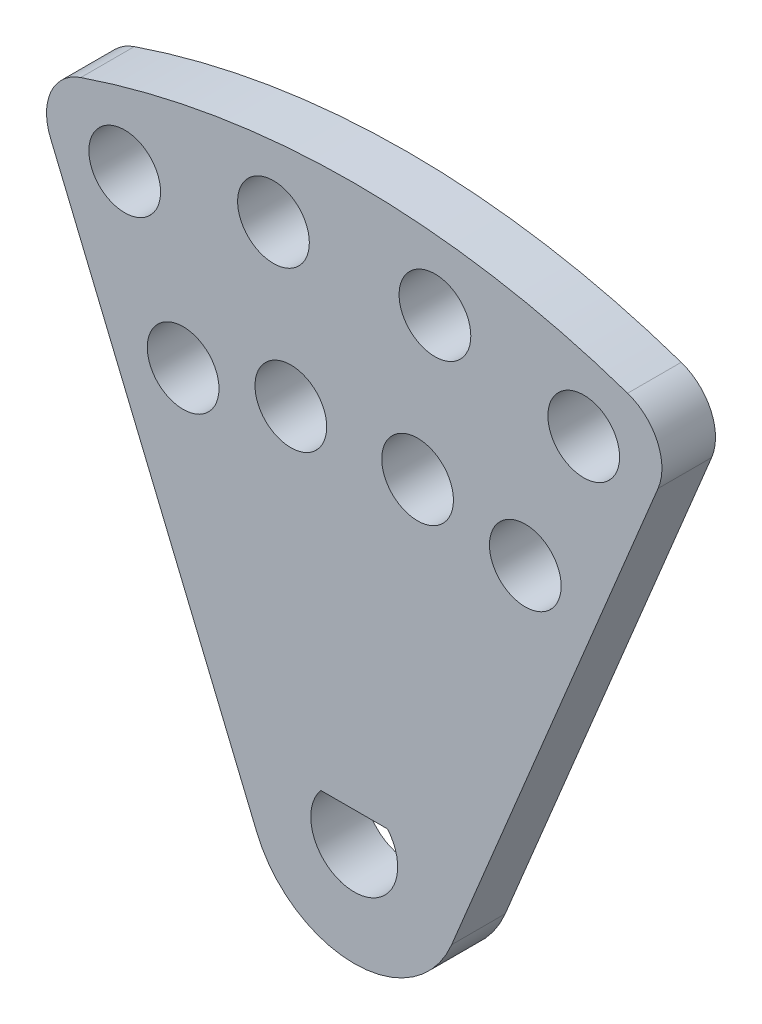
ISO-10303-21;
HEADER;
FILE_DESCRIPTION(('STEP AP214'),'2;1');
FILE_NAME('part.step','',(''),(''),'','','');
FILE_SCHEMA(('AUTOMOTIVE_DESIGN { 1 0 10303 214 1 1 1 1 }'));
ENDSEC;
DATA;
#1=APPLICATION_CONTEXT('core data for automotive mechanical design processes');
#2=APPLICATION_PROTOCOL_DEFINITION('international standard','automotive_design',2000,#1);
#3=PRODUCT_CONTEXT('',#1,'mechanical');
#4=PRODUCT('Part','Part','',(#3));
#5=PRODUCT_RELATED_PRODUCT_CATEGORY('part','',(#4));
#6=PRODUCT_DEFINITION_FORMATION('','',#4);
#7=PRODUCT_DEFINITION_CONTEXT('part definition',#1,'design');
#8=PRODUCT_DEFINITION('design','',#6,#7);
#9=PRODUCT_DEFINITION_SHAPE('','',#8);
#10=(LENGTH_UNIT() NAMED_UNIT(*) SI_UNIT(.MILLI.,.METRE.));
#11=(NAMED_UNIT(*) PLANE_ANGLE_UNIT() SI_UNIT($,.RADIAN.));
#12=(NAMED_UNIT(*) SI_UNIT($,.STERADIAN.) SOLID_ANGLE_UNIT());
#13=UNCERTAINTY_MEASURE_WITH_UNIT(LENGTH_MEASURE(1.E-05),#10,'distance_accuracy_value','');
#14=(GEOMETRIC_REPRESENTATION_CONTEXT(3) GLOBAL_UNCERTAINTY_ASSIGNED_CONTEXT((#13)) GLOBAL_UNIT_ASSIGNED_CONTEXT((#10,
#11,#12)) REPRESENTATION_CONTEXT('',''));
#15=CARTESIAN_POINT('',(0.,0.,0.));
#16=DIRECTION('',(0.,0.,1.));
#17=DIRECTION('',(1.,0.,0.));
#18=AXIS2_PLACEMENT_3D('',#15,#16,#17);
#19=CARTESIAN_POINT('',(0.,0.,6.35));
#20=DIRECTION('',(0.,0.,1.));
#21=DIRECTION('',(1.,0.,0.));
#22=AXIS2_PLACEMENT_3D('',#19,#20,#21);
#23=PLANE('',#22);
#24=CARTESIAN_POINT('',(7.51119571051967,40.9537358088287,6.35));
#25=DIRECTION('',(0.,0.,1.));
#26=DIRECTION('',(1.,0.,0.));
#27=AXIS2_PLACEMENT_3D('',#24,#25,#26);
#28=CIRCLE('',#27,4.25000000000001);
#29=CARTESIAN_POINT('',(11.7611957105197,40.9537358088287,6.35));
#30=VERTEX_POINT('',#29);
#31=EDGE_CURVE('E440',#30,#30,#28,.T.);
#32=ORIENTED_EDGE('',*,*,#31,.F.);
#33=EDGE_LOOP('',(#32));
#34=FACE_BOUND('',#33,.T.);
#35=CARTESIAN_POINT('',(-20.2781609144462,38.5033073806289,6.35));
#36=DIRECTION('',(0.,0.,1.));
#37=DIRECTION('',(1.,0.,0.));
#38=AXIS2_PLACEMENT_3D('',#35,#36,#37);
#39=CIRCLE('',#38,4.25);
#40=CARTESIAN_POINT('',(-16.0281609144462,38.5033073806289,6.35));
#41=VERTEX_POINT('',#40);
#42=EDGE_CURVE('E456',#41,#41,#39,.T.);
#43=ORIENTED_EDGE('',*,*,#42,.F.);
#44=EDGE_LOOP('',(#43));
#45=FACE_BOUND('',#44,.T.);
#46=CARTESIAN_POINT('',(9.56999845971288,58.8368282205326,6.35));
#47=DIRECTION('',(0.,0.,1.));
#48=DIRECTION('',(1.,0.,0.));
#49=AXIS2_PLACEMENT_3D('',#46,#47,#48);
#50=CIRCLE('',#49,4.25000000000001);
#51=CARTESIAN_POINT('',(13.8199984597129,58.8368282205326,6.35));
#52=VERTEX_POINT('',#51);
#53=EDGE_CURVE('E472',#52,#52,#50,.T.);
#54=ORIENTED_EDGE('',*,*,#53,.F.);
#55=EDGE_LOOP('',(#54));
#56=FACE_BOUND('',#55,.T.);
#57=CARTESIAN_POINT('',(-27.2033120613695,55.2221012010147,6.35));
#58=DIRECTION('',(0.,0.,1.));
#59=DIRECTION('',(1.,0.,0.));
#60=AXIS2_PLACEMENT_3D('',#57,#58,#59);
#61=CIRCLE('',#60,4.25);
#62=CARTESIAN_POINT('',(-22.9533120613695,55.2221012010147,6.35));
#63=VERTEX_POINT('',#62);
#64=EDGE_CURVE('E147',#63,#63,#61,.T.);
#65=ORIENTED_EDGE('',*,*,#64,.F.);
#66=EDGE_LOOP('',(#65));
#67=FACE_BOUND('',#66,.T.);
#68=DIRECTION('',(0.38268343236509,0.923879532511287,0.));
#69=VECTOR('',#68,1.);
#70=CARTESIAN_POINT('',(11.5484941563911,-4.78354290456363,6.35));
#71=LINE('',#70,#69);
#72=CARTESIAN_POINT('',(11.5484941563911,-4.78354290456363,6.35));
#73=VERTEX_POINT('',#72);
#74=CARTESIAN_POINT('',(36.0134940163505,54.2801915608061,6.35));
#75=VERTEX_POINT('',#74);
#76=EDGE_CURVE('E156',#73,#75,#71,.T.);
#77=ORIENTED_EDGE('',*,*,#76,.T.);
#78=CARTESIAN_POINT('',(30.4702168212828,56.5762921549967,6.35));
#79=DIRECTION('',(0.,0.,1.));
#80=DIRECTION('',(1.,0.,0.));
#81=AXIS2_PLACEMENT_3D('',#78,#79,#80);
#82=CIRCLE('',#81,6.);
#83=CARTESIAN_POINT('',(32.4089600834228,62.2544322169806,6.35));
#84=VERTEX_POINT('',#83);
#85=EDGE_CURVE('E57',#75,#84,#82,.T.);
#86=ORIENTED_EDGE('',*,*,#85,.T.);
#87=CARTESIAN_POINT('',(0.,-32.6640741219094,6.35));
#88=DIRECTION('',(0.,0.,1.));
#89=DIRECTION('',(-1.,0.,0.));
#90=AXIS2_PLACEMENT_3D('',#87,#88,#89);
#91=CIRCLE('',#90,100.298871076871);
#92=CARTESIAN_POINT('',(-32.4089600834228,62.2544322169806,6.35));
#93=VERTEX_POINT('',#92);
#94=EDGE_CURVE('E160',#84,#93,#91,.T.);
#95=ORIENTED_EDGE('',*,*,#94,.T.);
#96=CARTESIAN_POINT('',(-30.4702168212828,56.5762921549967,6.35));
#97=DIRECTION('',(0.,0.,1.));
#98=DIRECTION('',(1.,0.,0.));
#99=AXIS2_PLACEMENT_3D('',#96,#97,#98);
#100=CIRCLE('',#99,6.);
#101=CARTESIAN_POINT('',(-36.0134940163505,54.2801915608061,6.35));
#102=VERTEX_POINT('',#101);
#103=EDGE_CURVE('E64',#93,#102,#100,.T.);
#104=ORIENTED_EDGE('',*,*,#103,.T.);
#105=DIRECTION('',(0.38268343236509,-0.923879532511287,0.));
#106=VECTOR('',#105,1.);
#107=CARTESIAN_POINT('',(-11.5484941563911,-4.78354290456363,6.35));
#108=LINE('',#107,#106);
#109=CARTESIAN_POINT('',(-11.5484941563911,-4.78354290456363,6.35));
#110=VERTEX_POINT('',#109);
#111=EDGE_CURVE('E163',#102,#110,#108,.T.);
#112=ORIENTED_EDGE('',*,*,#111,.T.);
#113=CARTESIAN_POINT('',(0.,0.,6.35));
#114=DIRECTION('',(0.,0.,1.));
#115=DIRECTION('',(1.,0.,0.));
#116=AXIS2_PLACEMENT_3D('',#113,#114,#115);
#117=CIRCLE('',#116,12.5);
#118=EDGE_CURVE('E152',#110,#73,#117,.T.);
#119=ORIENTED_EDGE('',*,*,#118,.T.);
#120=EDGE_LOOP('',(#77,#86,#95,#104,#112,#119));
#121=FACE_BOUND('',#120,.T.);
#122=DIRECTION('',(-1.,0.,0.));
#123=VECTOR('',#122,1.);
#124=CARTESIAN_POINT('',(-3.95379564469384,3.3,6.35));
#125=LINE('',#124,#123);
#126=CARTESIAN_POINT('',(3.95379564469384,3.3,6.35));
#127=VERTEX_POINT('',#126);
#128=CARTESIAN_POINT('',(-3.95379564469384,3.3,6.35));
#129=VERTEX_POINT('',#128);
#130=EDGE_CURVE('E116',#127,#129,#125,.T.);
#131=ORIENTED_EDGE('',*,*,#130,.F.);
#132=CARTESIAN_POINT('',(0.,0.,6.35));
#133=DIRECTION('',(0.,0.,1.));
#134=DIRECTION('',(1.,0.,0.));
#135=AXIS2_PLACEMENT_3D('',#132,#133,#134);
#136=CIRCLE('',#135,5.15);
#137=EDGE_CURVE('E127',#129,#127,#136,.T.);
#138=ORIENTED_EDGE('',*,*,#137,.F.);
#139=EDGE_LOOP('',(#131,#138));
#140=FACE_BOUND('',#139,.T.);
#141=CARTESIAN_POINT('',(-9.56999845971288,58.8368282205326,6.35));
#142=DIRECTION('',(0.,0.,1.));
#143=DIRECTION('',(1.,0.,0.));
#144=AXIS2_PLACEMENT_3D('',#141,#142,#143);
#145=CIRCLE('',#144,4.25000000000001);
#146=CARTESIAN_POINT('',(-5.31999845971288,58.8368282205326,6.35));
#147=VERTEX_POINT('',#146);
#148=EDGE_CURVE('E480',#147,#147,#145,.T.);
#149=ORIENTED_EDGE('',*,*,#148,.F.);
#150=EDGE_LOOP('',(#149));
#151=FACE_BOUND('',#150,.T.);
#152=CARTESIAN_POINT('',(27.2033120613695,55.2221012010147,6.35));
#153=DIRECTION('',(0.,0.,1.));
#154=DIRECTION('',(1.,0.,0.));
#155=AXIS2_PLACEMENT_3D('',#152,#153,#154);
#156=CIRCLE('',#155,4.25);
#157=CARTESIAN_POINT('',(31.4533120613695,55.2221012010147,6.35));
#158=VERTEX_POINT('',#157);
#159=EDGE_CURVE('E464',#158,#158,#156,.T.);
#160=ORIENTED_EDGE('',*,*,#159,.F.);
#161=EDGE_LOOP('',(#160));
#162=FACE_BOUND('',#161,.T.);
#163=CARTESIAN_POINT('',(-7.51119571051968,40.9537358088287,6.35));
#164=DIRECTION('',(0.,0.,1.));
#165=DIRECTION('',(1.,0.,0.));
#166=AXIS2_PLACEMENT_3D('',#163,#164,#165);
#167=CIRCLE('',#166,4.25);
#168=CARTESIAN_POINT('',(-3.26119571051967,40.9537358088287,6.35));
#169=VERTEX_POINT('',#168);
#170=EDGE_CURVE('E448',#169,#169,#167,.T.);
#171=ORIENTED_EDGE('',*,*,#170,.F.);
#172=EDGE_LOOP('',(#171));
#173=FACE_BOUND('',#172,.T.);
#174=CARTESIAN_POINT('',(20.2781609144462,38.5033073806289,6.35));
#175=DIRECTION('',(0.,0.,1.));
#176=DIRECTION('',(1.,0.,0.));
#177=AXIS2_PLACEMENT_3D('',#174,#175,#176);
#178=CIRCLE('',#177,4.25);
#179=CARTESIAN_POINT('',(24.5281609144462,38.5033073806289,6.35));
#180=VERTEX_POINT('',#179);
#181=EDGE_CURVE('E428',#180,#180,#178,.T.);
#182=ORIENTED_EDGE('',*,*,#181,.F.);
#183=EDGE_LOOP('',(#182));
#184=FACE_BOUND('',#183,.T.);
#185=ADVANCED_FACE('F48',(#34,#45,#56,#67,#121,#140,#151,#162,#173,#184),#23,.T.);
#186=CARTESIAN_POINT('',(0.,0.,0.));
#187=DIRECTION('',(0.,0.,1.));
#188=DIRECTION('',(1.,0.,0.));
#189=AXIS2_PLACEMENT_3D('',#186,#187,#188);
#190=PLANE('',#189);
#191=CARTESIAN_POINT('',(0.,-32.6640741219094,0.));
#192=DIRECTION('',(0.,0.,1.));
#193=DIRECTION('',(-1.,0.,0.));
#194=AXIS2_PLACEMENT_3D('',#191,#192,#193);
#195=CIRCLE('',#194,100.298871076871);
#196=CARTESIAN_POINT('',(32.4089600834228,62.2544322169806,0.));
#197=VERTEX_POINT('',#196);
#198=CARTESIAN_POINT('',(-32.4089600834228,62.2544322169806,0.));
#199=VERTEX_POINT('',#198);
#200=EDGE_CURVE('E173',#197,#199,#195,.T.);
#201=ORIENTED_EDGE('',*,*,#200,.F.);
#202=CARTESIAN_POINT('',(30.4702168212828,56.5762921549967,0.));
#203=DIRECTION('',(0.,0.,1.));
#204=DIRECTION('',(1.,0.,0.));
#205=AXIS2_PLACEMENT_3D('',#202,#203,#204);
#206=CIRCLE('',#205,6.);
#207=CARTESIAN_POINT('',(36.0134940163505,54.2801915608061,0.));
#208=VERTEX_POINT('',#207);
#209=EDGE_CURVE('E196',#197,#208,#206,.F.);
#210=ORIENTED_EDGE('',*,*,#209,.T.);
#211=DIRECTION('',(0.38268343236509,0.923879532511287,0.));
#212=VECTOR('',#211,1.);
#213=CARTESIAN_POINT('',(11.5484941563911,-4.78354290456363,0.));
#214=LINE('',#213,#212);
#215=CARTESIAN_POINT('',(11.5484941563911,-4.78354290456363,0.));
#216=VERTEX_POINT('',#215);
#217=EDGE_CURVE('E170',#216,#208,#214,.T.);
#218=ORIENTED_EDGE('',*,*,#217,.F.);
#219=CARTESIAN_POINT('',(0.,0.,0.));
#220=DIRECTION('',(0.,0.,1.));
#221=DIRECTION('',(1.,0.,0.));
#222=AXIS2_PLACEMENT_3D('',#219,#220,#221);
#223=CIRCLE('',#222,12.5);
#224=CARTESIAN_POINT('',(-11.5484941563911,-4.78354290456363,0.));
#225=VERTEX_POINT('',#224);
#226=EDGE_CURVE('E151',#225,#216,#223,.T.);
#227=ORIENTED_EDGE('',*,*,#226,.F.);
#228=DIRECTION('',(0.38268343236509,-0.923879532511287,0.));
#229=VECTOR('',#228,1.);
#230=CARTESIAN_POINT('',(-11.5484941563911,-4.78354290456363,0.));
#231=LINE('',#230,#229);
#232=CARTESIAN_POINT('',(-36.0134940163505,54.2801915608061,0.));
#233=VERTEX_POINT('',#232);
#234=EDGE_CURVE('E157',#233,#225,#231,.T.);
#235=ORIENTED_EDGE('',*,*,#234,.F.);
#236=CARTESIAN_POINT('',(-30.4702168212828,56.5762921549967,0.));
#237=DIRECTION('',(0.,0.,1.));
#238=DIRECTION('',(1.,0.,0.));
#239=AXIS2_PLACEMENT_3D('',#236,#237,#238);
#240=CIRCLE('',#239,6.);
#241=EDGE_CURVE('E193',#233,#199,#240,.F.);
#242=ORIENTED_EDGE('',*,*,#241,.T.);
#243=EDGE_LOOP('',(#201,#210,#218,#227,#235,#242));
#244=FACE_BOUND('',#243,.T.);
#245=CARTESIAN_POINT('',(0.,0.,0.));
#246=DIRECTION('',(0.,0.,1.));
#247=DIRECTION('',(1.,0.,0.));
#248=AXIS2_PLACEMENT_3D('',#245,#246,#247);
#249=CIRCLE('',#248,5.15);
#250=CARTESIAN_POINT('',(-3.95379564469384,3.3,0.));
#251=VERTEX_POINT('',#250);
#252=CARTESIAN_POINT('',(3.95379564469384,3.3,0.));
#253=VERTEX_POINT('',#252);
#254=EDGE_CURVE('E132',#251,#253,#249,.T.);
#255=ORIENTED_EDGE('',*,*,#254,.T.);
#256=DIRECTION('',(-1.,0.,0.));
#257=VECTOR('',#256,1.);
#258=CARTESIAN_POINT('',(-3.95379564469384,3.3,0.));
#259=LINE('',#258,#257);
#260=EDGE_CURVE('E137',#253,#251,#259,.T.);
#261=ORIENTED_EDGE('',*,*,#260,.T.);
#262=EDGE_LOOP('',(#255,#261));
#263=FACE_BOUND('',#262,.T.);
#264=CARTESIAN_POINT('',(-27.2033120613695,55.2221012010147,0.));
#265=DIRECTION('',(0.,0.,1.));
#266=DIRECTION('',(1.,0.,0.));
#267=AXIS2_PLACEMENT_3D('',#264,#265,#266);
#268=CIRCLE('',#267,4.25);
#269=CARTESIAN_POINT('',(-22.9533120613695,55.2221012010147,0.));
#270=VERTEX_POINT('',#269);
#271=EDGE_CURVE('E143',#270,#270,#268,.T.);
#272=ORIENTED_EDGE('',*,*,#271,.T.);
#273=EDGE_LOOP('',(#272));
#274=FACE_BOUND('',#273,.T.);
#275=CARTESIAN_POINT('',(-9.56999845971288,58.8368282205326,0.));
#276=DIRECTION('',(0.,0.,1.));
#277=DIRECTION('',(1.,0.,0.));
#278=AXIS2_PLACEMENT_3D('',#275,#276,#277);
#279=CIRCLE('',#278,4.25000000000001);
#280=CARTESIAN_POINT('',(-5.31999845971288,58.8368282205326,0.));
#281=VERTEX_POINT('',#280);
#282=EDGE_CURVE('E476',#281,#281,#279,.T.);
#283=ORIENTED_EDGE('',*,*,#282,.T.);
#284=EDGE_LOOP('',(#283));
#285=FACE_BOUND('',#284,.T.);
#286=CARTESIAN_POINT('',(9.56999845971288,58.8368282205326,0.));
#287=DIRECTION('',(0.,0.,1.));
#288=DIRECTION('',(1.,0.,0.));
#289=AXIS2_PLACEMENT_3D('',#286,#287,#288);
#290=CIRCLE('',#289,4.25000000000001);
#291=CARTESIAN_POINT('',(13.8199984597129,58.8368282205326,0.));
#292=VERTEX_POINT('',#291);
#293=EDGE_CURVE('E468',#292,#292,#290,.T.);
#294=ORIENTED_EDGE('',*,*,#293,.T.);
#295=EDGE_LOOP('',(#294));
#296=FACE_BOUND('',#295,.T.);
#297=CARTESIAN_POINT('',(27.2033120613695,55.2221012010147,0.));
#298=DIRECTION('',(0.,0.,1.));
#299=DIRECTION('',(1.,0.,0.));
#300=AXIS2_PLACEMENT_3D('',#297,#298,#299);
#301=CIRCLE('',#300,4.25);
#302=CARTESIAN_POINT('',(31.4533120613695,55.2221012010147,0.));
#303=VERTEX_POINT('',#302);
#304=EDGE_CURVE('E460',#303,#303,#301,.T.);
#305=ORIENTED_EDGE('',*,*,#304,.T.);
#306=EDGE_LOOP('',(#305));
#307=FACE_BOUND('',#306,.T.);
#308=CARTESIAN_POINT('',(-20.2781609144462,38.5033073806289,0.));
#309=DIRECTION('',(0.,0.,1.));
#310=DIRECTION('',(1.,0.,0.));
#311=AXIS2_PLACEMENT_3D('',#308,#309,#310);
#312=CIRCLE('',#311,4.25);
#313=CARTESIAN_POINT('',(-16.0281609144462,38.5033073806289,0.));
#314=VERTEX_POINT('',#313);
#315=EDGE_CURVE('E452',#314,#314,#312,.T.);
#316=ORIENTED_EDGE('',*,*,#315,.T.);
#317=EDGE_LOOP('',(#316));
#318=FACE_BOUND('',#317,.T.);
#319=CARTESIAN_POINT('',(-7.51119571051968,40.9537358088287,0.));
#320=DIRECTION('',(0.,0.,1.));
#321=DIRECTION('',(1.,0.,0.));
#322=AXIS2_PLACEMENT_3D('',#319,#320,#321);
#323=CIRCLE('',#322,4.25);
#324=CARTESIAN_POINT('',(-3.26119571051967,40.9537358088287,0.));
#325=VERTEX_POINT('',#324);
#326=EDGE_CURVE('E444',#325,#325,#323,.T.);
#327=ORIENTED_EDGE('',*,*,#326,.T.);
#328=EDGE_LOOP('',(#327));
#329=FACE_BOUND('',#328,.T.);
#330=CARTESIAN_POINT('',(7.51119571051967,40.9537358088287,0.));
#331=DIRECTION('',(0.,0.,1.));
#332=DIRECTION('',(1.,0.,0.));
#333=AXIS2_PLACEMENT_3D('',#330,#331,#332);
#334=CIRCLE('',#333,4.25000000000001);
#335=CARTESIAN_POINT('',(11.7611957105197,40.9537358088287,0.));
#336=VERTEX_POINT('',#335);
#337=EDGE_CURVE('E437',#336,#336,#334,.T.);
#338=ORIENTED_EDGE('',*,*,#337,.T.);
#339=EDGE_LOOP('',(#338));
#340=FACE_BOUND('',#339,.T.);
#341=CARTESIAN_POINT('',(20.2781609144462,38.5033073806289,0.));
#342=DIRECTION('',(0.,0.,1.));
#343=DIRECTION('',(1.,0.,0.));
#344=AXIS2_PLACEMENT_3D('',#341,#342,#343);
#345=CIRCLE('',#344,4.25);
#346=CARTESIAN_POINT('',(24.5281609144462,38.5033073806289,0.));
#347=VERTEX_POINT('',#346);
#348=EDGE_CURVE('E431',#347,#347,#345,.T.);
#349=ORIENTED_EDGE('',*,*,#348,.T.);
#350=EDGE_LOOP('',(#349));
#351=FACE_BOUND('',#350,.T.);
#352=ADVANCED_FACE('F214',(#244,#263,#274,#285,#296,#307,#318,#329,#340,#351),#190,.F.);
#353=CARTESIAN_POINT('',(0.,0.,6.35));
#354=DIRECTION('',(0.,0.,-1.));
#355=DIRECTION('',(-1.,0.,0.));
#356=AXIS2_PLACEMENT_3D('',#353,#354,#355);
#357=CYLINDRICAL_SURFACE('',#356,12.5);
#358=ORIENTED_EDGE('',*,*,#226,.T.);
#359=DIRECTION('',(0.,0.,-1.));
#360=VECTOR('',#359,1.);
#361=CARTESIAN_POINT('',(11.5484941563911,-4.78354290456363,6.35));
#362=LINE('',#361,#360);
#363=EDGE_CURVE('E182',#73,#216,#362,.T.);
#364=ORIENTED_EDGE('',*,*,#363,.F.);
#365=ORIENTED_EDGE('',*,*,#118,.F.);
#366=DIRECTION('',(0.,0.,-1.));
#367=VECTOR('',#366,1.);
#368=CARTESIAN_POINT('',(-11.5484941563911,-4.78354290456363,6.35));
#369=LINE('',#368,#367);
#370=EDGE_CURVE('E166',#110,#225,#369,.T.);
#371=ORIENTED_EDGE('',*,*,#370,.T.);
#372=EDGE_LOOP('',(#358,#364,#365,#371));
#373=FACE_BOUND('',#372,.T.);
#374=ADVANCED_FACE('F221',(#373),#357,.T.);
#375=CARTESIAN_POINT('',(11.5484941563911,-4.78354290456363,6.35));
#376=DIRECTION('',(-0.923879532511287,0.38268343236509,0.));
#377=DIRECTION('',(-0.38268343236509,-0.923879532511287,0.));
#378=AXIS2_PLACEMENT_3D('',#375,#376,#377);
#379=PLANE('',#378);
#380=ORIENTED_EDGE('',*,*,#217,.T.);
#381=DIRECTION('',(0.,0.,-1.));
#382=VECTOR('',#381,1.);
#383=CARTESIAN_POINT('',(36.0134940163505,54.2801915608061,6.35));
#384=LINE('',#383,#382);
#385=EDGE_CURVE('E72',#208,#75,#384,.F.);
#386=ORIENTED_EDGE('',*,*,#385,.T.);
#387=ORIENTED_EDGE('',*,*,#76,.F.);
#388=ORIENTED_EDGE('',*,*,#363,.T.);
#389=EDGE_LOOP('',(#380,#386,#387,#388));
#390=FACE_BOUND('',#389,.T.);
#391=ADVANCED_FACE('F217',(#390),#379,.F.);
#392=CARTESIAN_POINT('',(0.,-32.6640741219094,6.35));
#393=DIRECTION('',(0.,0.,-1.));
#394=DIRECTION('',(-1.,0.,0.));
#395=AXIS2_PLACEMENT_3D('',#392,#393,#394);
#396=CYLINDRICAL_SURFACE('',#395,100.298871076871);
#397=ORIENTED_EDGE('',*,*,#94,.F.);
#398=DIRECTION('',(0.,0.,-1.));
#399=VECTOR('',#398,1.);
#400=CARTESIAN_POINT('',(32.4089600834228,62.2544322169806,6.35));
#401=LINE('',#400,#399);
#402=EDGE_CURVE('E189',#84,#197,#401,.T.);
#403=ORIENTED_EDGE('',*,*,#402,.T.);
#404=ORIENTED_EDGE('',*,*,#200,.T.);
#405=DIRECTION('',(0.,0.,-1.));
#406=VECTOR('',#405,1.);
#407=CARTESIAN_POINT('',(-32.4089600834228,62.2544322169806,6.35));
#408=LINE('',#407,#406);
#409=EDGE_CURVE('E186',#199,#93,#408,.F.);
#410=ORIENTED_EDGE('',*,*,#409,.T.);
#411=EDGE_LOOP('',(#397,#403,#404,#410));
#412=FACE_BOUND('',#411,.T.);
#413=ADVANCED_FACE('F209',(#412),#396,.T.);
#414=CARTESIAN_POINT('',(-11.5484941563911,-4.78354290456363,6.35));
#415=DIRECTION('',(0.923879532511287,0.38268343236509,0.));
#416=DIRECTION('',(-0.38268343236509,0.923879532511287,0.));
#417=AXIS2_PLACEMENT_3D('',#414,#415,#416);
#418=PLANE('',#417);
#419=ORIENTED_EDGE('',*,*,#111,.F.);
#420=DIRECTION('',(0.,0.,-1.));
#421=VECTOR('',#420,1.);
#422=CARTESIAN_POINT('',(-36.0134940163505,54.2801915608061,6.35));
#423=LINE('',#422,#421);
#424=EDGE_CURVE('E13',#102,#233,#423,.T.);
#425=ORIENTED_EDGE('',*,*,#424,.T.);
#426=ORIENTED_EDGE('',*,*,#234,.T.);
#427=ORIENTED_EDGE('',*,*,#370,.F.);
#428=EDGE_LOOP('',(#419,#425,#426,#427));
#429=FACE_BOUND('',#428,.T.);
#430=ADVANCED_FACE('F225',(#429),#418,.F.);
#431=CARTESIAN_POINT('',(0.,0.,6.35));
#432=DIRECTION('',(0.,0.,-1.));
#433=DIRECTION('',(-1.,0.,0.));
#434=AXIS2_PLACEMENT_3D('',#431,#432,#433);
#435=CYLINDRICAL_SURFACE('',#434,5.15);
#436=ORIENTED_EDGE('',*,*,#254,.F.);
#437=DIRECTION('',(0.,0.,-1.));
#438=VECTOR('',#437,1.);
#439=CARTESIAN_POINT('',(-3.95379564469384,3.3,6.35));
#440=LINE('',#439,#438);
#441=EDGE_CURVE('E119',#129,#251,#440,.T.);
#442=ORIENTED_EDGE('',*,*,#441,.F.);
#443=ORIENTED_EDGE('',*,*,#137,.T.);
#444=DIRECTION('',(0.,0.,-1.));
#445=VECTOR('',#444,1.);
#446=CARTESIAN_POINT('',(3.95379564469384,3.3,6.35));
#447=LINE('',#446,#445);
#448=EDGE_CURVE('E122',#127,#253,#447,.T.);
#449=ORIENTED_EDGE('',*,*,#448,.T.);
#450=EDGE_LOOP('',(#436,#442,#443,#449));
#451=FACE_BOUND('',#450,.T.);
#452=ADVANCED_FACE('F130',(#451),#435,.F.);
#453=CARTESIAN_POINT('',(-3.95379564469384,3.3,6.35));
#454=DIRECTION('',(0.,-1.,0.));
#455=DIRECTION('',(0.,0.,-1.));
#456=AXIS2_PLACEMENT_3D('',#453,#454,#455);
#457=PLANE('',#456);
#458=ORIENTED_EDGE('',*,*,#260,.F.);
#459=ORIENTED_EDGE('',*,*,#448,.F.);
#460=ORIENTED_EDGE('',*,*,#130,.T.);
#461=ORIENTED_EDGE('',*,*,#441,.T.);
#462=EDGE_LOOP('',(#458,#459,#460,#461));
#463=FACE_BOUND('',#462,.T.);
#464=ADVANCED_FACE('F118',(#463),#457,.T.);
#465=CARTESIAN_POINT('',(-27.2033120613695,55.2221012010147,6.35));
#466=DIRECTION('',(0.,0.,-1.));
#467=DIRECTION('',(-1.,0.,0.));
#468=AXIS2_PLACEMENT_3D('',#465,#466,#467);
#469=CYLINDRICAL_SURFACE('',#468,4.25);
#470=ORIENTED_EDGE('',*,*,#64,.T.);
#471=EDGE_LOOP('',(#470));
#472=FACE_BOUND('',#471,.T.);
#473=ORIENTED_EDGE('',*,*,#271,.F.);
#474=EDGE_LOOP('',(#473));
#475=FACE_BOUND('',#474,.T.);
#476=ADVANCED_FACE('F279',(#472,#475),#469,.F.);
#477=CARTESIAN_POINT('',(-9.56999845971288,58.8368282205326,6.35));
#478=DIRECTION('',(0.,0.,-1.));
#479=DIRECTION('',(-1.,0.,0.));
#480=AXIS2_PLACEMENT_3D('',#477,#478,#479);
#481=CYLINDRICAL_SURFACE('',#480,4.25000000000001);
#482=ORIENTED_EDGE('',*,*,#148,.T.);
#483=EDGE_LOOP('',(#482));
#484=FACE_BOUND('',#483,.T.);
#485=ORIENTED_EDGE('',*,*,#282,.F.);
#486=EDGE_LOOP('',(#485));
#487=FACE_BOUND('',#486,.T.);
#488=ADVANCED_FACE('F285',(#484,#487),#481,.F.);
#489=CARTESIAN_POINT('',(9.56999845971288,58.8368282205326,6.35));
#490=DIRECTION('',(0.,0.,-1.));
#491=DIRECTION('',(-1.,0.,0.));
#492=AXIS2_PLACEMENT_3D('',#489,#490,#491);
#493=CYLINDRICAL_SURFACE('',#492,4.25000000000001);
#494=ORIENTED_EDGE('',*,*,#53,.T.);
#495=EDGE_LOOP('',(#494));
#496=FACE_BOUND('',#495,.T.);
#497=ORIENTED_EDGE('',*,*,#293,.F.);
#498=EDGE_LOOP('',(#497));
#499=FACE_BOUND('',#498,.T.);
#500=ADVANCED_FACE('F293',(#496,#499),#493,.F.);
#501=CARTESIAN_POINT('',(27.2033120613695,55.2221012010147,6.35));
#502=DIRECTION('',(0.,0.,-1.));
#503=DIRECTION('',(-1.,0.,0.));
#504=AXIS2_PLACEMENT_3D('',#501,#502,#503);
#505=CYLINDRICAL_SURFACE('',#504,4.25);
#506=ORIENTED_EDGE('',*,*,#159,.T.);
#507=EDGE_LOOP('',(#506));
#508=FACE_BOUND('',#507,.T.);
#509=ORIENTED_EDGE('',*,*,#304,.F.);
#510=EDGE_LOOP('',(#509));
#511=FACE_BOUND('',#510,.T.);
#512=ADVANCED_FACE('F301',(#508,#511),#505,.F.);
#513=CARTESIAN_POINT('',(-20.2781609144462,38.5033073806289,6.35));
#514=DIRECTION('',(0.,0.,-1.));
#515=DIRECTION('',(-1.,0.,0.));
#516=AXIS2_PLACEMENT_3D('',#513,#514,#515);
#517=CYLINDRICAL_SURFACE('',#516,4.25);
#518=ORIENTED_EDGE('',*,*,#42,.T.);
#519=EDGE_LOOP('',(#518));
#520=FACE_BOUND('',#519,.T.);
#521=ORIENTED_EDGE('',*,*,#315,.F.);
#522=EDGE_LOOP('',(#521));
#523=FACE_BOUND('',#522,.T.);
#524=ADVANCED_FACE('F309',(#520,#523),#517,.F.);
#525=CARTESIAN_POINT('',(-7.51119571051968,40.9537358088287,6.35));
#526=DIRECTION('',(0.,0.,-1.));
#527=DIRECTION('',(-1.,0.,0.));
#528=AXIS2_PLACEMENT_3D('',#525,#526,#527);
#529=CYLINDRICAL_SURFACE('',#528,4.25);
#530=ORIENTED_EDGE('',*,*,#170,.T.);
#531=EDGE_LOOP('',(#530));
#532=FACE_BOUND('',#531,.T.);
#533=ORIENTED_EDGE('',*,*,#326,.F.);
#534=EDGE_LOOP('',(#533));
#535=FACE_BOUND('',#534,.T.);
#536=ADVANCED_FACE('F317',(#532,#535),#529,.F.);
#537=CARTESIAN_POINT('',(7.51119571051967,40.9537358088287,6.35));
#538=DIRECTION('',(0.,0.,-1.));
#539=DIRECTION('',(-1.,0.,0.));
#540=AXIS2_PLACEMENT_3D('',#537,#538,#539);
#541=CYLINDRICAL_SURFACE('',#540,4.25000000000001);
#542=ORIENTED_EDGE('',*,*,#31,.T.);
#543=EDGE_LOOP('',(#542));
#544=FACE_BOUND('',#543,.T.);
#545=ORIENTED_EDGE('',*,*,#337,.F.);
#546=EDGE_LOOP('',(#545));
#547=FACE_BOUND('',#546,.T.);
#548=ADVANCED_FACE('F325',(#544,#547),#541,.F.);
#549=CARTESIAN_POINT('',(20.2781609144462,38.5033073806289,6.35));
#550=DIRECTION('',(0.,0.,-1.));
#551=DIRECTION('',(-1.,0.,0.));
#552=AXIS2_PLACEMENT_3D('',#549,#550,#551);
#553=CYLINDRICAL_SURFACE('',#552,4.25);
#554=ORIENTED_EDGE('',*,*,#181,.T.);
#555=EDGE_LOOP('',(#554));
#556=FACE_BOUND('',#555,.T.);
#557=ORIENTED_EDGE('',*,*,#348,.F.);
#558=EDGE_LOOP('',(#557));
#559=FACE_BOUND('',#558,.T.);
#560=ADVANCED_FACE('F232',(#556,#559),#553,.F.);
#561=CARTESIAN_POINT('',(30.4702168212828,56.5762921549967,6.35));
#562=DIRECTION('',(0.,0.,-1.));
#563=DIRECTION('',(-1.,0.,0.));
#564=AXIS2_PLACEMENT_3D('',#561,#562,#563);
#565=CYLINDRICAL_SURFACE('',#564,6.);
#566=ORIENTED_EDGE('',*,*,#85,.F.);
#567=ORIENTED_EDGE('',*,*,#385,.F.);
#568=ORIENTED_EDGE('',*,*,#209,.F.);
#569=ORIENTED_EDGE('',*,*,#402,.F.);
#570=EDGE_LOOP('',(#566,#567,#568,#569));
#571=FACE_BOUND('',#570,.T.);
#572=ADVANCED_FACE('F212',(#571),#565,.T.);
#573=CARTESIAN_POINT('',(-30.4702168212828,56.5762921549967,6.35));
#574=DIRECTION('',(0.,0.,-1.));
#575=DIRECTION('',(-1.,0.,0.));
#576=AXIS2_PLACEMENT_3D('',#573,#574,#575);
#577=CYLINDRICAL_SURFACE('',#576,6.);
#578=ORIENTED_EDGE('',*,*,#103,.F.);
#579=ORIENTED_EDGE('',*,*,#409,.F.);
#580=ORIENTED_EDGE('',*,*,#241,.F.);
#581=ORIENTED_EDGE('',*,*,#424,.F.);
#582=EDGE_LOOP('',(#578,#579,#580,#581));
#583=FACE_BOUND('',#582,.T.);
#584=ADVANCED_FACE('F50',(#583),#577,.T.);
#585=CLOSED_SHELL('',(#185,#352,#374,#391,#413,#430,#452,#464,#476,#488,#500,#512,#524,#536,
#548,#560,#572,#584));
#586=MANIFOLD_SOLID_BREP('B2',#585);
#587=ADVANCED_BREP_SHAPE_REPRESENTATION('',(#18,#586),#14);
#588=SHAPE_DEFINITION_REPRESENTATION(#9,#587);
ENDSEC;
END-ISO-10303-21;
